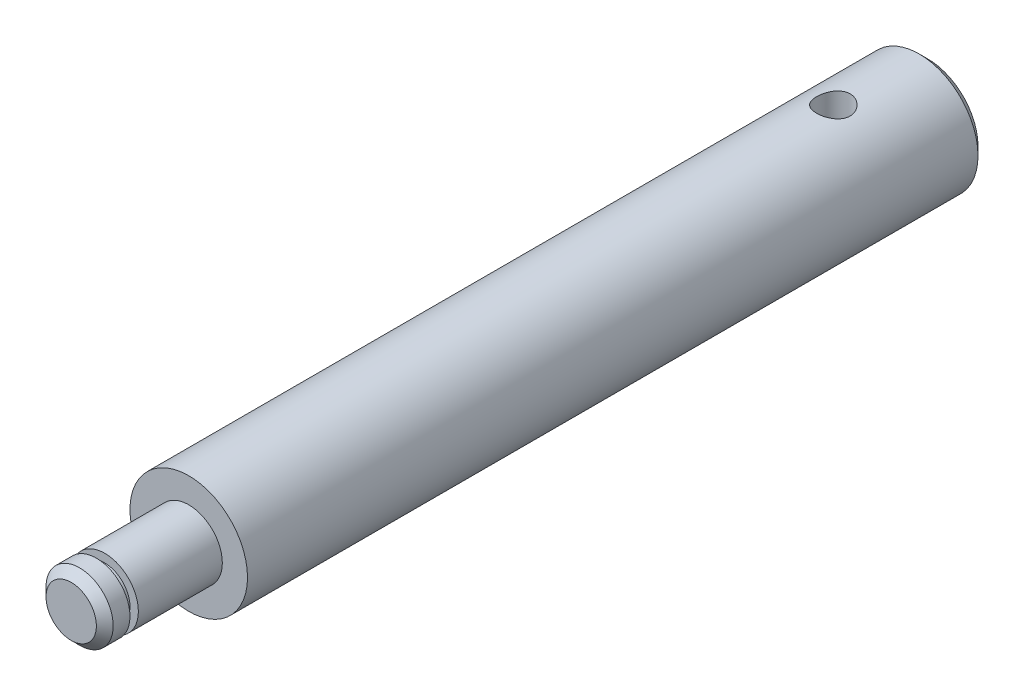
ISO-10303-21;
HEADER;
FILE_DESCRIPTION(('STEP AP214'),'2;1');
FILE_NAME('part.step','',(''),(''),'','','');
FILE_SCHEMA(('AUTOMOTIVE_DESIGN { 1 0 10303 214 1 1 1 1 }'));
ENDSEC;
DATA;
#1=APPLICATION_CONTEXT('core data for automotive mechanical design processes');
#2=APPLICATION_PROTOCOL_DEFINITION('international standard','automotive_design',2000,#1);
#3=PRODUCT_CONTEXT('',#1,'mechanical');
#4=PRODUCT('Part','Part','',(#3));
#5=PRODUCT_RELATED_PRODUCT_CATEGORY('part','',(#4));
#6=PRODUCT_DEFINITION_FORMATION('','',#4);
#7=PRODUCT_DEFINITION_CONTEXT('part definition',#1,'design');
#8=PRODUCT_DEFINITION('design','',#6,#7);
#9=PRODUCT_DEFINITION_SHAPE('','',#8);
#10=(LENGTH_UNIT() NAMED_UNIT(*) SI_UNIT(.MILLI.,.METRE.));
#11=(NAMED_UNIT(*) PLANE_ANGLE_UNIT() SI_UNIT($,.RADIAN.));
#12=(NAMED_UNIT(*) SI_UNIT($,.STERADIAN.) SOLID_ANGLE_UNIT());
#13=UNCERTAINTY_MEASURE_WITH_UNIT(LENGTH_MEASURE(1.E-05),#10,'distance_accuracy_value','');
#14=(GEOMETRIC_REPRESENTATION_CONTEXT(3) GLOBAL_UNCERTAINTY_ASSIGNED_CONTEXT((#13)) GLOBAL_UNIT_ASSIGNED_CONTEXT((#10,
#11,#12)) REPRESENTATION_CONTEXT('',''));
#15=CARTESIAN_POINT('',(0.,0.,0.));
#16=DIRECTION('',(0.,0.,1.));
#17=DIRECTION('',(1.,0.,0.));
#18=AXIS2_PLACEMENT_3D('',#15,#16,#17);
#19=CARTESIAN_POINT('',(0.,0.,44.));
#20=DIRECTION('',(0.,0.,-1.));
#21=DIRECTION('',(-1.,0.,0.));
#22=AXIS2_PLACEMENT_3D('',#19,#20,#21);
#23=CYLINDRICAL_SURFACE('',#22,3.5);
#24=CARTESIAN_POINT('',(0.,-3.5,6.61499999999999));
#25=CARTESIAN_POINT('',(0.0549774511886257,-3.49999934647171,6.61499903021902));
#26=CARTESIAN_POINT('',(0.109964873936291,-3.49869208701023,6.61045110551193));
#27=CARTESIAN_POINT('',(0.218345995598493,-3.4936045297255,6.59241786494884));
#28=CARTESIAN_POINT('',(0.271739083414806,-3.48982329605034,6.57892916696295));
#29=CARTESIAN_POINT('',(0.375352150368933,-3.48020345674544,6.54349598079174));
#30=CARTESIAN_POINT('',(0.425576440424111,-3.474367720532,6.52156328192401));
#31=CARTESIAN_POINT('',(0.521634380564631,-3.46124989158242,6.46991100426083));
#32=CARTESIAN_POINT('',(0.567467570589073,-3.45396764753901,6.44019061075485));
#33=CARTESIAN_POINT('',(0.654647223429474,-3.43852367312903,6.3729824946635));
#34=CARTESIAN_POINT('',(0.695861861190485,-3.4303452097302,6.33532762307221));
#35=CARTESIAN_POINT('',(0.77148567896215,-3.41413367457396,6.2536761284313));
#36=CARTESIAN_POINT('',(0.805893838538833,-3.40610062478085,6.20967855618443));
#37=CARTESIAN_POINT('',(0.867598950032222,-3.39091507439313,6.11550320860398));
#38=CARTESIAN_POINT('',(0.894739105517022,-3.38378351259109,6.06521900746546));
#39=CARTESIAN_POINT('',(0.940125852769608,-3.37145671914236,5.96056399412672));
#40=CARTESIAN_POINT('',(0.958374357777517,-3.36626107099664,5.9061940639724));
#41=CARTESIAN_POINT('',(0.984992165068869,-3.35856804120241,5.79638261841595));
#42=CARTESIAN_POINT('',(0.993602766016068,-3.35600489366891,5.74100431860089));
#43=CARTESIAN_POINT('',(1.00145333894794,-3.35367104182518,5.62953442575838));
#44=CARTESIAN_POINT('',(1.00069534704802,-3.35389973075334,5.57344299036685));
#45=CARTESIAN_POINT('',(0.990020673813946,-3.35706517184156,5.4640656942732));
#46=CARTESIAN_POINT('',(0.980401628641798,-3.35991391343389,5.41074782440997));
#47=CARTESIAN_POINT('',(0.95275693042909,-3.36785674196985,5.30651639018586));
#48=CARTESIAN_POINT('',(0.934730517406282,-3.37295103189706,5.25560304363966));
#49=CARTESIAN_POINT('',(0.890553405689013,-3.38488431756517,5.15687687778419));
#50=CARTESIAN_POINT('',(0.86430275586439,-3.39174458202416,5.10911146379919));
#51=CARTESIAN_POINT('',(0.804491895839429,-3.40642608441438,5.01856171939328));
#52=CARTESIAN_POINT('',(0.770930058366721,-3.41424753611068,4.97577850113254));
#53=CARTESIAN_POINT('',(0.695951998365096,-3.43033125328062,4.89471381219683));
#54=CARTESIAN_POINT('',(0.654287437422658,-3.43859902286152,4.85666276201639));
#55=CARTESIAN_POINT('',(0.565066141193109,-3.45438123609203,4.78803699817986));
#56=CARTESIAN_POINT('',(0.517509100740942,-3.46189564068921,4.75746267197915));
#57=CARTESIAN_POINT('',(0.417461536545719,-3.47538264032743,4.70453563261299));
#58=CARTESIAN_POINT('',(0.364944908904999,-3.48134637748612,4.68222985659792));
#59=CARTESIAN_POINT('',(0.256696614983732,-3.49099625743795,4.6468330542916));
#60=CARTESIAN_POINT('',(0.200965762905071,-3.49468297428128,4.63373970537737));
#61=CARTESIAN_POINT('',(0.0898331943221739,-3.49927437257336,4.61751335714528));
#62=CARTESIAN_POINT('',(0.0344806734302531,-3.50026636425301,4.6140676523135));
#63=CARTESIAN_POINT('',(-0.0760132634027908,-3.49961042353544,4.61636363315053));
#64=CARTESIAN_POINT('',(-0.131154703878552,-3.49796280790309,4.62210421642296));
#65=CARTESIAN_POINT('',(-0.238509316715158,-3.49226963342609,4.64235522215814));
#66=CARTESIAN_POINT('',(-0.290759105867426,-3.48827306508862,4.65668659066172));
#67=CARTESIAN_POINT('',(-0.392104343102812,-3.4783399937092,4.69350025099233));
#68=CARTESIAN_POINT('',(-0.441199425624334,-3.47240326632855,4.71598348544462));
#69=CARTESIAN_POINT('',(-0.536020842560034,-3.45904980584657,4.76901166832263));
#70=CARTESIAN_POINT('',(-0.581651243270123,-3.45160381589488,4.7997205994129));
#71=CARTESIAN_POINT('',(-0.66721926402965,-3.43608973548903,4.86812625297533));
#72=CARTESIAN_POINT('',(-0.70715558542121,-3.42802150376367,4.90582456503144));
#73=CARTESIAN_POINT('',(-0.781553214170348,-3.41184309815947,4.9886046710256));
#74=CARTESIAN_POINT('',(-0.815792713704764,-3.40374018433795,5.03388763778285));
#75=CARTESIAN_POINT('',(-0.876197658032574,-3.38869447362751,5.12973129430901));
#76=CARTESIAN_POINT('',(-0.902363383738848,-3.3817516363796,5.18029180037321));
#77=CARTESIAN_POINT('',(-0.945687270594165,-3.36989325638715,5.28504560549588));
#78=CARTESIAN_POINT('',(-0.96289316621221,-3.36496700079019,5.33921788178635));
#79=CARTESIAN_POINT('',(-0.987897250353697,-3.35771228398835,5.4498549678272));
#80=CARTESIAN_POINT('',(-0.995698289511603,-3.35538303564047,5.50631907755101));
#81=CARTESIAN_POINT('',(-1.00149012123095,-3.35365851547576,5.61764801646077));
#82=CARTESIAN_POINT('',(-0.999840138221134,-3.35415580399703,5.67249275227629));
#83=CARTESIAN_POINT('',(-0.987623554788207,-3.35777298607399,5.78108736533289));
#84=CARTESIAN_POINT('',(-0.977057251899594,-3.36089279211717,5.8348372790465));
#85=CARTESIAN_POINT('',(-0.947529844083134,-3.36933488579116,5.93918918558376));
#86=CARTESIAN_POINT('',(-0.928655458931756,-3.37463438524179,5.98981769350544));
#87=CARTESIAN_POINT('',(-0.883114746507961,-3.38683651421364,6.08722936724624));
#88=CARTESIAN_POINT('',(-0.85644704021577,-3.3937394274128,6.13401185063665));
#89=CARTESIAN_POINT('',(-0.795032732674117,-3.40865834474881,6.22409176090262));
#90=CARTESIAN_POINT('',(-0.760046138613649,-3.41670381589509,6.26722069567096));
#91=CARTESIAN_POINT('',(-0.683429920189671,-3.43284922546139,6.34711194790491));
#92=CARTESIAN_POINT('',(-0.641798625364273,-3.4409491770859,6.3838726595554));
#93=CARTESIAN_POINT('',(-0.551787160432689,-3.45653979786176,6.4509185921633));
#94=CARTESIAN_POINT('',(-0.503261251179884,-3.46400950518705,6.48101349363481));
#95=CARTESIAN_POINT('',(-0.401625264823326,-3.47725697888987,6.532572892511));
#96=CARTESIAN_POINT('',(-0.348517712057365,-3.48303566935144,6.55404210596653));
#97=CARTESIAN_POINT('',(-0.246458157667514,-3.49163672362654,6.58542377569772));
#98=CARTESIAN_POINT('',(-0.197881503812192,-3.49474842181038,6.59648676834227));
#99=CARTESIAN_POINT('',(-0.0995391843931819,-3.49893021926074,6.61127482862106));
#100=CARTESIAN_POINT('',(-0.0497736788080448,-3.50000059166998,6.61500087798844));
#101=CARTESIAN_POINT('',(0.,-3.5,6.61499999999999));
#102=B_SPLINE_CURVE_WITH_KNOTS('',3,(#24,#25,#26,#27,#28,#29,#30,#31,#32,#33,#34,#35,#36,#37,
#38,#39,#40,#41,#42,#43,#44,#45,#46,#47,#48,#49,#50,#51,#52,#53,#54,#55,#56,#57,#58,#59,#60,#61,
#62,#63,#64,#65,#66,#67,#68,#69,#70,#71,#72,#73,#74,#75,#76,#77,#78,#79,#80,#81,#82,#83,#84,#85,
#86,#87,#88,#89,#90,#91,#92,#93,#94,#95,#96,#97,#98,#99,#100,#101),.UNSPECIFIED.,.T.,.F.,(4,2,2,
2,2,2,2,2,2,2,2,2,2,2,2,2,2,2,2,2,2,2,2,2,2,2,2,2,2,2,2,2,2,2,2,2,2,2,4),(0.,0.164749656271171,
0.329561669897588,0.494144406447668,0.658744367717574,0.827239057653901,0.99575898936856,
1.16766537650028,1.33953475772404,1.50699754929407,1.67442394611626,1.83642392910676,
1.99843855889073,2.16250401641615,2.32660602784681,2.4968925029726,2.66718780073734,
2.83843550548233,3.00964002003315,3.17522728845109,3.34079468713333,3.50302570235768,
3.66527548283773,3.83103762668234,3.99683751589902,4.16806052438175,4.33927757478657,
4.50957286677745,4.67981652887077,4.84363340801446,5.00744482086199,5.16958548138841,
5.33175484991997,5.4993382843839,5.66696391547445,5.8388898947829,6.01072174610252,
6.15989734012181,6.30905297207067),.UNSPECIFIED.);
#103=CARTESIAN_POINT('',(0.,-3.5,6.61499999999999));
#104=VERTEX_POINT('',#103);
#105=EDGE_CURVE('E10',#104,#104,#102,.T.);
#106=ORIENTED_EDGE('',*,*,#105,.T.);
#107=EDGE_LOOP('',(#106));
#108=FACE_BOUND('',#107,.T.);
#109=CARTESIAN_POINT('',(0.,3.5,6.61499999999999));
#110=CARTESIAN_POINT('',(-0.0549774511886252,3.49999934647171,6.61499903021902));
#111=CARTESIAN_POINT('',(-0.10996487393629,3.49869208701023,6.61045110551193));
#112=CARTESIAN_POINT('',(-0.218345995598493,3.4936045297255,6.59241786494884));
#113=CARTESIAN_POINT('',(-0.271739083414805,3.48982329605034,6.57892916696295));
#114=CARTESIAN_POINT('',(-0.375352150368933,3.48020345674544,6.54349598079174));
#115=CARTESIAN_POINT('',(-0.42557644042411,3.474367720532,6.52156328192401));
#116=CARTESIAN_POINT('',(-0.52163438056463,3.46124989158242,6.46991100426083));
#117=CARTESIAN_POINT('',(-0.567467570589073,3.45396764753901,6.44019061075485));
#118=CARTESIAN_POINT('',(-0.654647223429473,3.43852367312903,6.3729824946635));
#119=CARTESIAN_POINT('',(-0.695861861190484,3.4303452097302,6.33532762307221));
#120=CARTESIAN_POINT('',(-0.771485678962149,3.41413367457396,6.2536761284313));
#121=CARTESIAN_POINT('',(-0.805893838538832,3.40610062478085,6.20967855618443));
#122=CARTESIAN_POINT('',(-0.867598950032221,3.39091507439313,6.11550320860398));
#123=CARTESIAN_POINT('',(-0.894739105517021,3.38378351259109,6.06521900746546));
#124=CARTESIAN_POINT('',(-0.940125852769607,3.37145671914236,5.96056399412672));
#125=CARTESIAN_POINT('',(-0.958374357777516,3.36626107099664,5.9061940639724));
#126=CARTESIAN_POINT('',(-0.984992165068868,3.35856804120241,5.79638261841595));
#127=CARTESIAN_POINT('',(-0.993602766016067,3.35600489366891,5.74100431860089));
#128=CARTESIAN_POINT('',(-1.00145333894794,3.35367104182518,5.62953442575838));
#129=CARTESIAN_POINT('',(-1.00069534704802,3.35389973075334,5.57344299036685));
#130=CARTESIAN_POINT('',(-0.990020673813945,3.35706517184156,5.4640656942732));
#131=CARTESIAN_POINT('',(-0.980401628641797,3.35991391343389,5.41074782440997));
#132=CARTESIAN_POINT('',(-0.952756930429089,3.36785674196985,5.30651639018586));
#133=CARTESIAN_POINT('',(-0.934730517406281,3.37295103189706,5.25560304363966));
#134=CARTESIAN_POINT('',(-0.890553405689012,3.38488431756517,5.15687687778419));
#135=CARTESIAN_POINT('',(-0.864302755864389,3.39174458202416,5.10911146379919));
#136=CARTESIAN_POINT('',(-0.804491895839428,3.40642608441438,5.01856171939328));
#137=CARTESIAN_POINT('',(-0.770930058366721,3.41424753611068,4.97577850113254));
#138=CARTESIAN_POINT('',(-0.695951998365096,3.43033125328062,4.89471381219683));
#139=CARTESIAN_POINT('',(-0.654287437422658,3.43859902286152,4.85666276201639));
#140=CARTESIAN_POINT('',(-0.565066141193109,3.45438123609203,4.78803699817986));
#141=CARTESIAN_POINT('',(-0.517509100740942,3.46189564068921,4.75746267197915));
#142=CARTESIAN_POINT('',(-0.417461536545719,3.47538264032743,4.70453563261299));
#143=CARTESIAN_POINT('',(-0.364944908904999,3.48134637748612,4.68222985659792));
#144=CARTESIAN_POINT('',(-0.256696614983732,3.49099625743795,4.6468330542916));
#145=CARTESIAN_POINT('',(-0.200965762905071,3.49468297428128,4.63373970537737));
#146=CARTESIAN_POINT('',(-0.0898331943221731,3.49927437257336,4.61751335714528));
#147=CARTESIAN_POINT('',(-0.0344806734302523,3.50026636425301,4.6140676523135));
#148=CARTESIAN_POINT('',(0.0760132634027915,3.49961042353544,4.61636363315053));
#149=CARTESIAN_POINT('',(0.131154703878552,3.49796280790309,4.62210421642296));
#150=CARTESIAN_POINT('',(0.238509316715158,3.49226963342609,4.64235522215814));
#151=CARTESIAN_POINT('',(0.290759105867426,3.48827306508862,4.65668659066172));
#152=CARTESIAN_POINT('',(0.392104343102813,3.4783399937092,4.69350025099233));
#153=CARTESIAN_POINT('',(0.441199425624335,3.47240326632854,4.71598348544461));
#154=CARTESIAN_POINT('',(0.536020842560035,3.45904980584657,4.76901166832263));
#155=CARTESIAN_POINT('',(0.581651243270124,3.45160381589488,4.7997205994129));
#156=CARTESIAN_POINT('',(0.667219264029651,3.43608973548903,4.86812625297533));
#157=CARTESIAN_POINT('',(0.70715558542121,3.42802150376367,4.90582456503144));
#158=CARTESIAN_POINT('',(0.781553214170348,3.41184309815947,4.9886046710256));
#159=CARTESIAN_POINT('',(0.815792713704765,3.40374018433795,5.03388763778285));
#160=CARTESIAN_POINT('',(0.876197658032575,3.38869447362751,5.12973129430901));
#161=CARTESIAN_POINT('',(0.902363383738849,3.3817516363796,5.18029180037321));
#162=CARTESIAN_POINT('',(0.945687270594166,3.36989325638715,5.28504560549588));
#163=CARTESIAN_POINT('',(0.96289316621221,3.36496700079018,5.33921788178635));
#164=CARTESIAN_POINT('',(0.987897250353698,3.35771228398835,5.4498549678272));
#165=CARTESIAN_POINT('',(0.995698289511604,3.35538303564047,5.50631907755101));
#166=CARTESIAN_POINT('',(1.00149012123095,3.35365851547576,5.61764801646077));
#167=CARTESIAN_POINT('',(0.999840138221135,3.35415580399703,5.67249275227629));
#168=CARTESIAN_POINT('',(0.987623554788208,3.35777298607399,5.78108736533289));
#169=CARTESIAN_POINT('',(0.977057251899595,3.36089279211717,5.8348372790465));
#170=CARTESIAN_POINT('',(0.947529844083135,3.36933488579116,5.93918918558376));
#171=CARTESIAN_POINT('',(0.928655458931757,3.37463438524179,5.98981769350544));
#172=CARTESIAN_POINT('',(0.883114746507963,3.38683651421364,6.08722936724624));
#173=CARTESIAN_POINT('',(0.856447040215771,3.3937394274128,6.13401185063665));
#174=CARTESIAN_POINT('',(0.795032732674118,3.40865834474881,6.22409176090262));
#175=CARTESIAN_POINT('',(0.76004613861365,3.41670381589509,6.26722069567096));
#176=CARTESIAN_POINT('',(0.683429920189673,3.43284922546139,6.34711194790491));
#177=CARTESIAN_POINT('',(0.641798625364275,3.4409491770859,6.3838726595554));
#178=CARTESIAN_POINT('',(0.551787160432691,3.45653979786176,6.4509185921633));
#179=CARTESIAN_POINT('',(0.503261251179886,3.46400950518705,6.48101349363481));
#180=CARTESIAN_POINT('',(0.401625264823327,3.47725697888987,6.532572892511));
#181=CARTESIAN_POINT('',(0.348517712057366,3.48303566935144,6.55404210596653));
#182=CARTESIAN_POINT('',(0.246458157667515,3.49163672362654,6.58542377569772));
#183=CARTESIAN_POINT('',(0.197881503812193,3.49474842181038,6.59648676834227));
#184=CARTESIAN_POINT('',(0.0995391843931827,3.49893021926074,6.61127482862106));
#185=CARTESIAN_POINT('',(0.0497736788080455,3.50000059166998,6.61500087798844));
#186=CARTESIAN_POINT('',(0.,3.5,6.61499999999999));
#187=B_SPLINE_CURVE_WITH_KNOTS('',3,(#109,#110,#111,#112,#113,#114,#115,#116,#117,#118,#119,
#120,#121,#122,#123,#124,#125,#126,#127,#128,#129,#130,#131,#132,#133,#134,#135,#136,#137,#138,
#139,#140,#141,#142,#143,#144,#145,#146,#147,#148,#149,#150,#151,#152,#153,#154,#155,#156,#157,
#158,#159,#160,#161,#162,#163,#164,#165,#166,#167,#168,#169,#170,#171,#172,#173,#174,#175,#176,
#177,#178,#179,#180,#181,#182,#183,#184,#185,#186),.UNSPECIFIED.,.T.,.F.,(4,2,2,2,2,2,2,2,2,2,2,
2,2,2,2,2,2,2,2,2,2,2,2,2,2,2,2,2,2,2,2,2,2,2,2,2,2,2,4),(0.,0.164749656271171,
0.329561669897588,0.494144406447667,0.658744367717574,0.827239057653901,0.99575898936856,
1.16766537650028,1.33953475772404,1.50699754929407,1.67442394611626,1.83642392910676,
1.99843855889073,2.16250401641614,2.32660602784681,2.4968925029726,2.66718780073733,
2.83843550548233,3.00964002003315,3.17522728845109,3.34079468713333,3.50302570235768,
3.66527548283773,3.83103762668234,3.99683751589902,4.16806052438175,4.33927757478657,
4.50957286677745,4.67981652887077,4.84363340801446,5.00744482086199,5.16958548138841,
5.33175484991997,5.4993382843839,5.66696391547445,5.8388898947829,6.01072174610252,
6.15989734012181,6.30905297207067),.UNSPECIFIED.);
#188=CARTESIAN_POINT('',(0.,3.5,6.61499999999999));
#189=VERTEX_POINT('',#188);
#190=EDGE_CURVE('E60',#189,#189,#187,.T.);
#191=ORIENTED_EDGE('',*,*,#190,.T.);
#192=EDGE_LOOP('',(#191));
#193=FACE_BOUND('',#192,.T.);
#194=CARTESIAN_POINT('',(0.,0.,0.5));
#195=DIRECTION('',(0.,0.,1.));
#196=DIRECTION('',(1.,0.,0.));
#197=AXIS2_PLACEMENT_3D('',#194,#195,#196);
#198=CIRCLE('',#197,3.5);
#199=CARTESIAN_POINT('',(3.5,0.,0.5));
#200=VERTEX_POINT('',#199);
#201=EDGE_CURVE('E68',#200,#200,#198,.T.);
#202=ORIENTED_EDGE('',*,*,#201,.T.);
#203=EDGE_LOOP('',(#202));
#204=FACE_BOUND('',#203,.T.);
#205=CARTESIAN_POINT('',(0.,0.,44.));
#206=DIRECTION('',(0.,0.,1.));
#207=DIRECTION('',(1.,0.,0.));
#208=AXIS2_PLACEMENT_3D('',#205,#206,#207);
#209=CIRCLE('',#208,3.5);
#210=CARTESIAN_POINT('',(3.5,0.,44.));
#211=VERTEX_POINT('',#210);
#212=EDGE_CURVE('E127',#211,#211,#209,.T.);
#213=ORIENTED_EDGE('',*,*,#212,.F.);
#214=EDGE_LOOP('',(#213));
#215=FACE_BOUND('',#214,.T.);
#216=ADVANCED_FACE('F47',(#108,#193,#204,#215),#23,.T.);
#217=CARTESIAN_POINT('',(0.,0.,44.));
#218=DIRECTION('',(0.,0.,1.));
#219=DIRECTION('',(1.,0.,0.));
#220=AXIS2_PLACEMENT_3D('',#217,#218,#219);
#221=PLANE('',#220);
#222=CARTESIAN_POINT('',(0.,0.,44.));
#223=DIRECTION('',(0.,0.,1.));
#224=DIRECTION('',(1.,0.,0.));
#225=AXIS2_PLACEMENT_3D('',#222,#223,#224);
#226=CIRCLE('',#225,2.);
#227=CARTESIAN_POINT('',(2.,0.,44.));
#228=VERTEX_POINT('',#227);
#229=EDGE_CURVE('E129',#228,#228,#226,.T.);
#230=ORIENTED_EDGE('',*,*,#229,.F.);
#231=EDGE_LOOP('',(#230));
#232=FACE_BOUND('',#231,.T.);
#233=ORIENTED_EDGE('',*,*,#212,.T.);
#234=EDGE_LOOP('',(#233));
#235=FACE_BOUND('',#234,.T.);
#236=ADVANCED_FACE('F108',(#232,#235),#221,.T.);
#237=CARTESIAN_POINT('',(0.,0.,0.));
#238=DIRECTION('',(0.,0.,1.));
#239=DIRECTION('',(1.,0.,0.));
#240=AXIS2_PLACEMENT_3D('',#237,#238,#239);
#241=PLANE('',#240);
#242=CARTESIAN_POINT('',(0.,0.,0.));
#243=DIRECTION('',(0.,0.,1.));
#244=DIRECTION('',(1.,0.,0.));
#245=AXIS2_PLACEMENT_3D('',#242,#243,#244);
#246=CIRCLE('',#245,3.);
#247=CARTESIAN_POINT('',(3.,0.,0.));
#248=VERTEX_POINT('',#247);
#249=EDGE_CURVE('E64',#248,#248,#246,.F.);
#250=ORIENTED_EDGE('',*,*,#249,.T.);
#251=EDGE_LOOP('',(#250));
#252=FACE_BOUND('',#251,.T.);
#253=ADVANCED_FACE('F106',(#252),#241,.F.);
#254=CARTESIAN_POINT('',(0.,0.,49.));
#255=DIRECTION('',(0.,0.,-1.));
#256=DIRECTION('',(-1.,0.,0.));
#257=AXIS2_PLACEMENT_3D('',#254,#255,#256);
#258=CYLINDRICAL_SURFACE('',#257,2.);
#259=CARTESIAN_POINT('',(0.,0.,49.));
#260=DIRECTION('',(0.,0.,1.));
#261=DIRECTION('',(1.,0.,0.));
#262=AXIS2_PLACEMENT_3D('',#259,#260,#261);
#263=CIRCLE('',#262,2.);
#264=CARTESIAN_POINT('',(2.,0.,49.));
#265=VERTEX_POINT('',#264);
#266=EDGE_CURVE('E130',#265,#265,#263,.T.);
#267=ORIENTED_EDGE('',*,*,#266,.F.);
#268=EDGE_LOOP('',(#267));
#269=FACE_BOUND('',#268,.T.);
#270=ORIENTED_EDGE('',*,*,#229,.T.);
#271=EDGE_LOOP('',(#270));
#272=FACE_BOUND('',#271,.T.);
#273=ADVANCED_FACE('F102',(#269,#272),#258,.T.);
#274=CARTESIAN_POINT('',(0.,0.,49.));
#275=DIRECTION('',(0.,0.,1.));
#276=DIRECTION('',(1.,0.,0.));
#277=AXIS2_PLACEMENT_3D('',#274,#275,#276);
#278=PLANE('',#277);
#279=CARTESIAN_POINT('',(0.,0.,49.));
#280=DIRECTION('',(0.,0.,1.));
#281=DIRECTION('',(1.,0.,0.));
#282=AXIS2_PLACEMENT_3D('',#279,#280,#281);
#283=CIRCLE('',#282,1.5);
#284=CARTESIAN_POINT('',(1.5,0.,49.));
#285=VERTEX_POINT('',#284);
#286=EDGE_CURVE('E133',#285,#285,#283,.T.);
#287=ORIENTED_EDGE('',*,*,#286,.F.);
#288=EDGE_LOOP('',(#287));
#289=FACE_BOUND('',#288,.T.);
#290=ORIENTED_EDGE('',*,*,#266,.T.);
#291=EDGE_LOOP('',(#290));
#292=FACE_BOUND('',#291,.T.);
#293=ADVANCED_FACE('F98',(#289,#292),#278,.T.);
#294=CARTESIAN_POINT('',(0.,0.,49.5));
#295=DIRECTION('',(0.,0.,-1.));
#296=DIRECTION('',(-1.,0.,0.));
#297=AXIS2_PLACEMENT_3D('',#294,#295,#296);
#298=CYLINDRICAL_SURFACE('',#297,1.5);
#299=CARTESIAN_POINT('',(0.,0.,49.5));
#300=DIRECTION('',(0.,0.,1.));
#301=DIRECTION('',(1.,0.,0.));
#302=AXIS2_PLACEMENT_3D('',#299,#300,#301);
#303=CIRCLE('',#302,1.5);
#304=CARTESIAN_POINT('',(1.5,0.,49.5));
#305=VERTEX_POINT('',#304);
#306=EDGE_CURVE('E136',#305,#305,#303,.T.);
#307=ORIENTED_EDGE('',*,*,#306,.F.);
#308=EDGE_LOOP('',(#307));
#309=FACE_BOUND('',#308,.T.);
#310=ORIENTED_EDGE('',*,*,#286,.T.);
#311=EDGE_LOOP('',(#310));
#312=FACE_BOUND('',#311,.T.);
#313=ADVANCED_FACE('F94',(#309,#312),#298,.T.);
#314=CARTESIAN_POINT('',(0.,0.,51.));
#315=DIRECTION('',(0.,0.,-1.));
#316=DIRECTION('',(-1.,0.,0.));
#317=AXIS2_PLACEMENT_3D('',#314,#315,#316);
#318=CYLINDRICAL_SURFACE('',#317,2.);
#319=CARTESIAN_POINT('',(0.,0.,50.5));
#320=DIRECTION('',(0.,0.,1.));
#321=DIRECTION('',(1.,0.,0.));
#322=AXIS2_PLACEMENT_3D('',#319,#320,#321);
#323=CIRCLE('',#322,2.);
#324=CARTESIAN_POINT('',(2.,0.,50.5));
#325=VERTEX_POINT('',#324);
#326=EDGE_CURVE('E142',#325,#325,#323,.F.);
#327=ORIENTED_EDGE('',*,*,#326,.T.);
#328=EDGE_LOOP('',(#327));
#329=FACE_BOUND('',#328,.T.);
#330=CARTESIAN_POINT('',(0.,0.,49.5));
#331=DIRECTION('',(0.,0.,1.));
#332=DIRECTION('',(1.,0.,0.));
#333=AXIS2_PLACEMENT_3D('',#330,#331,#332);
#334=CIRCLE('',#333,2.);
#335=CARTESIAN_POINT('',(2.,0.,49.5));
#336=VERTEX_POINT('',#335);
#337=EDGE_CURVE('E236',#336,#336,#334,.T.);
#338=ORIENTED_EDGE('',*,*,#337,.T.);
#339=EDGE_LOOP('',(#338));
#340=FACE_BOUND('',#339,.T.);
#341=ADVANCED_FACE('F86',(#329,#340),#318,.T.);
#342=CARTESIAN_POINT('',(0.,0.,51.));
#343=DIRECTION('',(0.,0.,1.));
#344=DIRECTION('',(1.,0.,0.));
#345=AXIS2_PLACEMENT_3D('',#342,#343,#344);
#346=PLANE('',#345);
#347=CARTESIAN_POINT('',(0.,0.,51.));
#348=DIRECTION('',(0.,0.,1.));
#349=DIRECTION('',(1.,0.,0.));
#350=AXIS2_PLACEMENT_3D('',#347,#348,#349);
#351=CIRCLE('',#350,1.5);
#352=CARTESIAN_POINT('',(1.5,0.,51.));
#353=VERTEX_POINT('',#352);
#354=EDGE_CURVE('E139',#353,#353,#351,.T.);
#355=ORIENTED_EDGE('',*,*,#354,.T.);
#356=EDGE_LOOP('',(#355));
#357=FACE_BOUND('',#356,.T.);
#358=ADVANCED_FACE('F81',(#357),#346,.T.);
#359=CARTESIAN_POINT('',(0.,0.,49.5));
#360=DIRECTION('',(0.,0.,1.));
#361=DIRECTION('',(1.,0.,0.));
#362=AXIS2_PLACEMENT_3D('',#359,#360,#361);
#363=PLANE('',#362);
#364=ORIENTED_EDGE('',*,*,#306,.T.);
#365=EDGE_LOOP('',(#364));
#366=FACE_BOUND('',#365,.T.);
#367=ORIENTED_EDGE('',*,*,#337,.F.);
#368=EDGE_LOOP('',(#367));
#369=FACE_BOUND('',#368,.T.);
#370=ADVANCED_FACE('F85',(#366,#369),#363,.F.);
#371=CARTESIAN_POINT('',(0.,0.,51.));
#372=DIRECTION('',(0.,0.,-1.));
#373=DIRECTION('',(-1.,0.,0.));
#374=AXIS2_PLACEMENT_3D('',#371,#372,#373);
#375=CONICAL_SURFACE('',#374,1.5,0.78539816339744);
#376=ORIENTED_EDGE('',*,*,#326,.F.);
#377=EDGE_LOOP('',(#376));
#378=FACE_BOUND('',#377,.T.);
#379=ORIENTED_EDGE('',*,*,#354,.F.);
#380=EDGE_LOOP('',(#379));
#381=FACE_BOUND('',#380,.T.);
#382=ADVANCED_FACE('F90',(#378,#381),#375,.T.);
#383=CARTESIAN_POINT('',(0.,0.,0.5));
#384=DIRECTION('',(0.,0.,1.));
#385=DIRECTION('',(1.,0.,0.));
#386=AXIS2_PLACEMENT_3D('',#383,#384,#385);
#387=CONICAL_SURFACE('',#386,3.5,0.785398163397446);
#388=ORIENTED_EDGE('',*,*,#249,.F.);
#389=EDGE_LOOP('',(#388));
#390=FACE_BOUND('',#389,.T.);
#391=ORIENTED_EDGE('',*,*,#201,.F.);
#392=EDGE_LOOP('',(#391));
#393=FACE_BOUND('',#392,.T.);
#394=ADVANCED_FACE('F50',(#390,#393),#387,.T.);
#395=CARTESIAN_POINT('',(0.,3.5,5.615));
#396=DIRECTION('',(0.,1.,0.));
#397=DIRECTION('',(0.,0.,1.));
#398=AXIS2_PLACEMENT_3D('',#395,#396,#397);
#399=CYLINDRICAL_SURFACE('',#398,0.999999999999993);
#400=ORIENTED_EDGE('',*,*,#190,.F.);
#401=EDGE_LOOP('',(#400));
#402=FACE_BOUND('',#401,.T.);
#403=ORIENTED_EDGE('',*,*,#105,.F.);
#404=EDGE_LOOP('',(#403));
#405=FACE_BOUND('',#404,.T.);
#406=ADVANCED_FACE('F76',(#402,#405),#399,.F.);
#407=CLOSED_SHELL('',(#216,#236,#253,#273,#293,#313,#341,#358,#370,#382,#394,#406));
#408=MANIFOLD_SOLID_BREP('B2',#407);
#409=ADVANCED_BREP_SHAPE_REPRESENTATION('',(#18,#408),#14);
#410=SHAPE_DEFINITION_REPRESENTATION(#9,#409);
ENDSEC;
END-ISO-10303-21;
